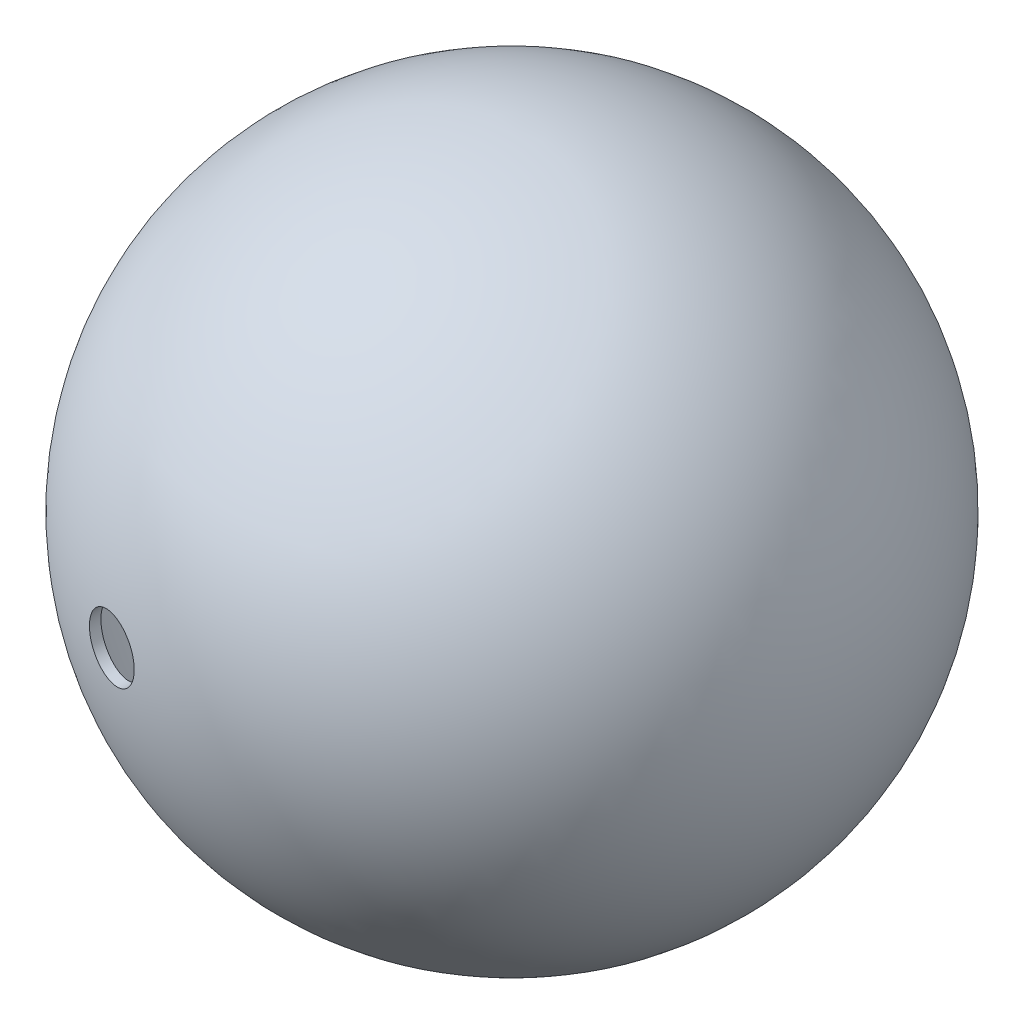
ISO-10303-21;
HEADER;
FILE_DESCRIPTION(('STEP AP214'),'2;1');
FILE_NAME('part.step','',(''),(''),'','','');
FILE_SCHEMA(('AUTOMOTIVE_DESIGN { 1 0 10303 214 1 1 1 1 }'));
ENDSEC;
DATA;
#1=APPLICATION_CONTEXT('core data for automotive mechanical design processes');
#2=APPLICATION_PROTOCOL_DEFINITION('international standard','automotive_design',2000,#1);
#3=PRODUCT_CONTEXT('',#1,'mechanical');
#4=PRODUCT('Part','Part','',(#3));
#5=PRODUCT_RELATED_PRODUCT_CATEGORY('part','',(#4));
#6=PRODUCT_DEFINITION_FORMATION('','',#4);
#7=PRODUCT_DEFINITION_CONTEXT('part definition',#1,'design');
#8=PRODUCT_DEFINITION('design','',#6,#7);
#9=PRODUCT_DEFINITION_SHAPE('','',#8);
#10=(LENGTH_UNIT() NAMED_UNIT(*) SI_UNIT(.MILLI.,.METRE.));
#11=(NAMED_UNIT(*) PLANE_ANGLE_UNIT() SI_UNIT($,.RADIAN.));
#12=(NAMED_UNIT(*) SI_UNIT($,.STERADIAN.) SOLID_ANGLE_UNIT());
#13=UNCERTAINTY_MEASURE_WITH_UNIT(LENGTH_MEASURE(1.E-05),#10,'distance_accuracy_value','');
#14=(GEOMETRIC_REPRESENTATION_CONTEXT(3) GLOBAL_UNCERTAINTY_ASSIGNED_CONTEXT((#13)) GLOBAL_UNIT_ASSIGNED_CONTEXT((#10,
#11,#12)) REPRESENTATION_CONTEXT('',''));
#15=CARTESIAN_POINT('',(0.,0.,0.));
#16=DIRECTION('',(0.,0.,1.));
#17=DIRECTION('',(1.,0.,0.));
#18=AXIS2_PLACEMENT_3D('',#15,#16,#17);
#19=CARTESIAN_POINT('',(0.,0.,0.));
#20=DIRECTION('',(0.,1.,0.));
#21=DIRECTION('',(1.,0.,0.));
#22=AXIS2_PLACEMENT_3D('',#19,#20,#21);
#23=SPHERICAL_SURFACE('',#22,11.99);
#24=CARTESIAN_POINT('',(-3.95136058227673,-0.552189317616778,11.3067208555947));
#25=CARTESIAN_POINT('',(-3.92007006963208,-0.606093087319684,11.3150231329755));
#26=CARTESIAN_POINT('',(-3.88423802164864,-0.657240591148591,11.3245213102823));
#27=CARTESIAN_POINT('',(-3.8046783739078,-0.75256841648249,11.3455780125305));
#28=CARTESIAN_POINT('',(-3.76093829258161,-0.796737514159434,11.3571397941678));
#29=CARTESIAN_POINT('',(-3.66703639502787,-0.876847951739898,11.3819169969643));
#30=CARTESIAN_POINT('',(-3.61688677865954,-0.912804569935177,11.3951292755283));
#31=CARTESIAN_POINT('',(-3.51158198788507,-0.975728787554527,11.4228192475459));
#32=CARTESIAN_POINT('',(-3.45642809601233,-1.00269868193103,11.4372966167374));
#33=CARTESIAN_POINT('',(-3.34124062454943,-1.04760050331811,11.4674709103668));
#34=CARTESIAN_POINT('',(-3.28112143498747,-1.06529874869775,11.4831888276857));
#35=CARTESIAN_POINT('',(-3.15886602784906,-1.09025478415775,11.5150839433738));
#36=CARTESIAN_POINT('',(-3.09672944398037,-1.09751066728654,11.5312612250808));
#37=CARTESIAN_POINT('',(-2.97081068101053,-1.10145273022891,11.5639746172238));
#38=CARTESIAN_POINT('',(-2.90702140670561,-1.09791307165853,11.5805111089258));
#39=CARTESIAN_POINT('',(-2.78089818541203,-1.07983939798418,11.6131381273939));
#40=CARTESIAN_POINT('',(-2.71856429950102,-1.06530492231744,11.6292286354489));
#41=CARTESIAN_POINT('',(-2.59707860147303,-1.02554547056807,11.6605263050606));
#42=CARTESIAN_POINT('',(-2.537930516673,-1.00030826611846,11.6757324335034));
#43=CARTESIAN_POINT('',(-2.42467599062205,-0.939747078835163,11.7047962585116));
#44=CARTESIAN_POINT('',(-2.37056912714535,-0.90442394175439,11.7186540680094));
#45=CARTESIAN_POINT('',(-2.27007810948992,-0.825362623719269,11.7443515623027));
#46=CARTESIAN_POINT('',(-2.22356668947404,-0.781797195528925,11.7562246064173));
#47=CARTESIAN_POINT('',(-2.13855862553192,-0.687000447767174,11.7778973493299));
#48=CARTESIAN_POINT('',(-2.10006059764951,-0.635770454538776,11.7876974061487));
#49=CARTESIAN_POINT('',(-2.03343087931812,-0.528767938142816,11.8046425016905));
#50=CARTESIAN_POINT('',(-2.00501965541982,-0.473180828867069,11.8118591897618));
#51=CARTESIAN_POINT('',(-1.95794447148124,-0.357773353017351,11.8238094169681));
#52=CARTESIAN_POINT('',(-1.93927876715179,-0.297953746169371,11.8285434004675));
#53=CARTESIAN_POINT('',(-1.91273011621139,-0.177585073089124,11.8352748333832));
#54=CARTESIAN_POINT('',(-1.9045598962234,-0.117103326132756,11.8373451917913));
#55=CARTESIAN_POINT('',(-1.89832834082966,0.0044094872714547,11.8389243869402));
#56=CARTESIAN_POINT('',(-1.9002659825601,0.0654404975127244,11.8384334828677));
#57=CARTESIAN_POINT('',(-1.91408630331005,0.185447383369671,11.8349307177107));
#58=CARTESIAN_POINT('',(-1.92583385585512,0.244439901233852,11.8319531096446));
#59=CARTESIAN_POINT('',(-1.95870618739566,0.359571002139498,11.8236153571741));
#60=CARTESIAN_POINT('',(-1.97983100938861,0.41570957209347,11.8182552018449));
#61=CARTESIAN_POINT('',(-2.03093056585431,0.523934308119346,11.8052767334101));
#62=CARTESIAN_POINT('',(-2.06095792140453,0.57599398361792,11.7976449923314));
#63=CARTESIAN_POINT('',(-2.12887448215882,0.674323285325342,11.7803619455448));
#64=CARTESIAN_POINT('',(-2.16676443604278,0.720592359477629,11.7707104475141));
#65=CARTESIAN_POINT('',(-2.25022077455481,0.807172670156223,11.7494208768963));
#66=CARTESIAN_POINT('',(-2.29594193906558,0.847324755179683,11.7377426695921));
#67=CARTESIAN_POINT('',(-2.39309229671554,0.919414831035465,11.7128860890259));
#68=CARTESIAN_POINT('',(-2.44452232746755,0.951351614220797,11.6997074956179));
#69=CARTESIAN_POINT('',(-2.55329451164522,1.00712539890945,11.6717836439493));
#70=CARTESIAN_POINT('',(-2.61076871691144,1.03068718213538,11.6570029786318));
#71=CARTESIAN_POINT('',(-2.72865827630604,1.06779877282052,11.6266238025337));
#72=CARTESIAN_POINT('',(-2.78907406686747,1.08134708976136,11.6110251703676));
#73=CARTESIAN_POINT('',(-2.9128066837522,1.09836101784881,11.5790121549413));
#74=CARTESIAN_POINT('',(-2.97615810616852,1.10155578399867,11.5625871070558));
#75=CARTESIAN_POINT('',(-3.10248180661712,1.09703825862355,11.5297648963618));
#76=CARTESIAN_POINT('',(-3.16545405006725,1.0893249869455,11.5133677361918));
#77=CARTESIAN_POINT('',(-3.2899102647017,1.06303273478237,11.4808930314656));
#78=CARTESIAN_POINT('',(-3.35137193433293,1.04434153758964,11.4648205873668));
#79=CARTESIAN_POINT('',(-3.47032479225684,0.996446175410824,11.4336518351617));
#80=CARTESIAN_POINT('',(-3.52781606301422,0.967242228851597,11.418555506782));
#81=CARTESIAN_POINT('',(-3.63648499832363,0.89941347787477,11.3899689365462));
#82=CARTESIAN_POINT('',(-3.68772434043957,0.860894214522903,11.3764630602257));
#83=CARTESIAN_POINT('',(-3.78298167180451,0.775267093569931,11.351315710672));
#84=CARTESIAN_POINT('',(-3.82700074243292,0.728160524324276,11.3396739582553));
#85=CARTESIAN_POINT('',(-3.9052076033121,0.628105506150249,11.3189645691928));
#86=CARTESIAN_POINT('',(-3.93963869343792,0.575360491248587,11.309833322968));
#87=CARTESIAN_POINT('',(-3.99910594065723,0.46448047975156,11.2940482995499));
#88=CARTESIAN_POINT('',(-4.02414443339751,0.406346827632753,11.2873939064433));
#89=CARTESIAN_POINT('',(-4.06327547004254,0.288406657523373,11.276988672681));
#90=CARTESIAN_POINT('',(-4.07770189306788,0.22871860999623,11.2731492800628));
#91=CARTESIAN_POINT('',(-4.09643164587365,0.107649275597538,11.2681638479551));
#92=CARTESIAN_POINT('',(-4.10073377461714,0.0462677887083777,11.2670181280139));
#93=CARTESIAN_POINT('',(-4.09907831624573,-0.0750479152176993,11.2674588997241));
#94=CARTESIAN_POINT('',(-4.09333375846744,-0.134985514691149,11.268988660659));
#95=CARTESIAN_POINT('',(-4.07219264708447,-0.252951857043323,11.2746153807927));
#96=CARTESIAN_POINT('',(-4.05680873775026,-0.310982995907006,11.278708976917));
#97=CARTESIAN_POINT('',(-4.02550436768047,-0.399383702321013,11.2870316129476));
#98=CARTESIAN_POINT('',(-4.01263994872038,-0.430948683819797,11.290450594328));
#99=CARTESIAN_POINT('',(-3.98408587743288,-0.492677850648538,11.2980351913969));
#100=CARTESIAN_POINT('',(-3.96839631327502,-0.522842079657431,11.3022007837845));
#101=CARTESIAN_POINT('',(-3.95136058227673,-0.552189317616778,11.3067208555947));
#102=B_SPLINE_CURVE_WITH_KNOTS('',3,(#24,#25,#26,#27,#28,#29,#30,#31,#32,#33,#34,#35,#36,#37,
#38,#39,#40,#41,#42,#43,#44,#45,#46,#47,#48,#49,#50,#51,#52,#53,#54,#55,#56,#57,#58,#59,#60,#61,
#62,#63,#64,#65,#66,#67,#68,#69,#70,#71,#72,#73,#74,#75,#76,#77,#78,#79,#80,#81,#82,#83,#84,#85,
#86,#87,#88,#89,#90,#91,#92,#93,#94,#95,#96,#97,#98,#99,#100,#101),.UNSPECIFIED.,.T.,.F.,(4,2,2,
2,2,2,2,2,2,2,2,2,2,2,2,2,2,2,2,2,2,2,2,2,2,2,2,2,2,2,2,2,2,2,2,2,2,2,4),(0.,0.188503977465546,
0.377308117832125,0.565758097559766,0.75415991559979,0.947105902832931,1.14008712079054,
1.33713291849562,1.53418697072495,1.73146677556009,1.9287300424109,2.12224297672385,
2.31572246252578,2.50332077153593,2.69088549198584,2.87319859147564,3.05549324217181,
3.23531751839425,3.41514261917158,3.59605257209164,3.77697975924403,3.96201548871129,
4.14707840285348,4.33775746417944,4.52846490263534,4.72412253069713,4.91979774089524,
5.11750884339824,5.31521583822966,5.51077993820477,5.70631472176504,5.89630710195313,
6.08625220557836,6.26993055703049,6.45363069700076,6.63348274724932,6.81309937181975,
6.91573122370195,7.01835987311655),.UNSPECIFIED.);
#103=CARTESIAN_POINT('',(-3.95136058227673,-0.552189317616778,11.3067208555947));
#104=VERTEX_POINT('',#103);
#105=EDGE_CURVE('E10',#104,#104,#102,.T.);
#106=ORIENTED_EDGE('',*,*,#105,.F.);
#107=EDGE_LOOP('',(#106));
#108=FACE_BOUND('',#107,.T.);
#109=CARTESIAN_POINT('',(0.,0.,-11.608625));
#110=DIRECTION('',(0.,0.,-1.));
#111=DIRECTION('',(-1.,0.,0.));
#112=AXIS2_PLACEMENT_3D('',#109,#110,#111);
#113=CIRCLE('',#112,2.99998760153688);
#114=CARTESIAN_POINT('',(2.99998760153688,0.,-11.608625));
#115=VERTEX_POINT('',#114);
#116=EDGE_CURVE('E46',#115,#115,#113,.T.);
#117=ORIENTED_EDGE('',*,*,#116,.F.);
#118=EDGE_LOOP('',(#117));
#119=FACE_BOUND('',#118,.T.);
#120=ADVANCED_FACE('F33',(#108,#119),#23,.T.);
#121=CARTESIAN_POINT('',(0.,0.,0.));
#122=DIRECTION('',(0.,1.,0.));
#123=DIRECTION('',(1.,0.,0.));
#124=AXIS2_PLACEMENT_3D('',#121,#122,#123);
#125=SPHERICAL_SURFACE('',#124,11.6);
#126=CARTESIAN_POINT('',(-3.94750064705811,-0.558786653226896,10.893346415021));
#127=CARTESIAN_POINT('',(-3.91579921975448,-0.612534579250892,10.9020769062187));
#128=CARTESIAN_POINT('',(-3.87957116553582,-0.663477403184826,10.9120435658877));
#129=CARTESIAN_POINT('',(-3.79927398504121,-0.758309849159791,10.9340970142459));
#130=CARTESIAN_POINT('',(-3.75519220579061,-0.802187868780123,10.9461872236909));
#131=CARTESIAN_POINT('',(-3.66068432151484,-0.8816451637554,10.9720581822312));
#132=CARTESIAN_POINT('',(-3.61027092671872,-0.917240668248733,10.9858355431542));
#133=CARTESIAN_POINT('',(-3.50451958860304,-0.979399019813475,11.0146761285415));
#134=CARTESIAN_POINT('',(-3.44918292329045,-1.00596420243884,11.0297390192606));
#135=CARTESIAN_POINT('',(-3.33360698301853,-1.05006167741685,11.0611306166593));
#136=CARTESIAN_POINT('',(-3.27327792725348,-1.06734258782366,11.0774819854143));
#137=CARTESIAN_POINT('',(-3.15067674642512,-1.09142151118508,11.1106351929725));
#138=CARTESIAN_POINT('',(-3.08840425126167,-1.09821751485778,11.1274371174909));
#139=CARTESIAN_POINT('',(-2.96222054914891,-1.10120036205318,11.1614054394383));
#140=CARTESIAN_POINT('',(-2.89830353942117,-1.0971494411157,11.1785716860875));
#141=CARTESIAN_POINT('',(-2.77200655347582,-1.07800677515282,11.2124148685054));
#142=CARTESIAN_POINT('',(-2.7096266415614,-1.06291456903241,11.2290917838089));
#143=CARTESIAN_POINT('',(-2.58817258270224,-1.02201086643739,11.2614931198596));
#144=CARTESIAN_POINT('',(-2.52910039282389,-0.996193098496265,11.2772169771592));
#145=CARTESIAN_POINT('',(-2.41609313257974,-0.934450136642098,11.3072395737712));
#146=CARTESIAN_POINT('',(-2.36215758166076,-0.898525889476521,11.3215384464026));
#147=CARTESIAN_POINT('',(-2.26220748567293,-0.81834054334261,11.3479921895439));
#148=CARTESIAN_POINT('',(-2.21605108015498,-0.774269152763383,11.3601855886095));
#149=CARTESIAN_POINT('',(-2.13183754994337,-0.678496493260177,11.3824030161895));
#150=CARTESIAN_POINT('',(-2.09377890357566,-0.626796660917066,11.3924274522861));
#151=CARTESIAN_POINT('',(-2.02817778983461,-0.519046988934957,11.4096891104602));
#152=CARTESIAN_POINT('',(-2.00033232720215,-0.463194495566803,11.4170067054663));
#153=CARTESIAN_POINT('',(-1.95442294632343,-0.347344836980255,11.4290637822135));
#154=CARTESIAN_POINT('',(-1.9363571613717,-0.287348465195671,11.4338037559613));
#155=CARTESIAN_POINT('',(-1.91103420147838,-0.166831479453876,11.4404460383348));
#156=CARTESIAN_POINT('',(-1.90347252654432,-0.106379114349185,11.4424282922287));
#157=CARTESIAN_POINT('',(-1.89842726540228,0.0149708238779417,11.4437509980386));
#158=CARTESIAN_POINT('',(-1.90094262258378,0.0758683496554567,11.4430917269272));
#159=CARTESIAN_POINT('',(-1.91585657770953,0.195489269868782,11.4391810972663));
#160=CARTESIAN_POINT('',(-1.92811736862142,0.254231116009758,11.4359658814213));
#161=CARTESIAN_POINT('',(-1.96193873403137,0.368775103905187,11.4270900555164));
#162=CARTESIAN_POINT('',(-1.98349938433741,0.424577221692228,11.4214294255227));
#163=CARTESIAN_POINT('',(-2.03540341871431,0.532111899087534,11.4077879584004));
#164=CARTESIAN_POINT('',(-2.06580741920898,0.583813126625235,11.3997911059944));
#165=CARTESIAN_POINT('',(-2.13438241155406,0.681368028368884,11.38173039798));
#166=CARTESIAN_POINT('',(-2.17255420441354,0.72722109872324,11.3716663292007));
#167=CARTESIAN_POINT('',(-2.25655391424891,0.813006419629246,11.3494846679263));
#168=CARTESIAN_POINT('',(-2.3025470349824,0.852765321718532,11.3373226590591));
#169=CARTESIAN_POINT('',(-2.40014946809869,0.924030569034005,11.3114663144553));
#170=CARTESIAN_POINT('',(-2.45175965853658,0.955535621395972,11.2977717391399));
#171=CARTESIAN_POINT('',(-2.56091686965299,1.01047458350766,11.2687495225816));
#172=CARTESIAN_POINT('',(-2.61860221431262,1.03361333352975,11.2533833031621));
#173=CARTESIAN_POINT('',(-2.73683038033006,1.06984402530607,11.2218210088649));
#174=CARTESIAN_POINT('',(-2.79737365112182,1.08293438123745,11.2056248034301));
#175=CARTESIAN_POINT('',(-2.92137870360376,1.0990148852532,11.1723771613039));
#176=CARTESIAN_POINT('',(-2.98487494409137,1.10171700109753,11.1553144553916));
#177=CARTESIAN_POINT('',(-3.1114043869395,1.0961752370632,11.1212348292407));
#178=CARTESIAN_POINT('',(-3.17443754480302,1.08793031878092,11.104217913499));
#179=CARTESIAN_POINT('',(-3.29895197502935,1.06053490425555,11.0705273115183));
#180=CARTESIAN_POINT('',(-3.36040926613918,1.04126807340143,11.053859284981));
#181=CARTESIAN_POINT('',(-3.47925857229266,0.992191520771177,11.0215565875019));
#182=CARTESIAN_POINT('',(-3.53665068763212,0.962382059211124,11.0059218910666));
#183=CARTESIAN_POINT('',(-3.64495220273247,0.893369868533277,10.9763610963771));
#184=CARTESIAN_POINT('',(-3.69593139873714,0.854284682475225,10.9624166763168));
#185=CARTESIAN_POINT('',(-3.79057221663591,0.767537441602637,10.9364864154228));
#186=CARTESIAN_POINT('',(-3.83423504349491,0.719876801803759,10.9245002520831));
#187=CARTESIAN_POINT('',(-3.91154170008896,0.618879134849739,10.9032499563278));
#188=CARTESIAN_POINT('',(-3.94545214136898,0.565761503673728,10.8939135056544));
#189=CARTESIAN_POINT('',(-4.00381986137927,0.45420842759505,10.8778281789588));
#190=CARTESIAN_POINT('',(-4.02827965714226,0.395774403760463,10.8710786139637));
#191=CARTESIAN_POINT('',(-4.06617491692198,0.277475132929482,10.8606158697491));
#192=CARTESIAN_POINT('',(-4.07996967277621,0.21773358826422,10.8568037481663));
#193=CARTESIAN_POINT('',(-4.09744956945863,0.0966633633104391,10.8519725668646));
#194=CARTESIAN_POINT('',(-4.10113358213362,0.0353345066808022,10.8509538188293));
#195=CARTESIAN_POINT('',(-4.09829015091979,-0.0857024829913383,10.851739912789));
#196=CARTESIAN_POINT('',(-4.09198587916278,-0.145416556218633,10.8534830450529));
#197=CARTESIAN_POINT('',(-4.06980182839987,-0.262840623633015,10.8596131771284));
#198=CARTESIAN_POINT('',(-4.05393461950268,-0.320553143649803,10.8639967062369));
#199=CARTESIAN_POINT('',(-4.02203032253996,-0.408162536546849,10.8728022096993));
#200=CARTESIAN_POINT('',(-4.00903751695097,-0.439289814340409,10.876386832159));
#201=CARTESIAN_POINT('',(-3.98029999434148,-0.50014419939676,10.884310534198));
#202=CARTESIAN_POINT('',(-3.96455537396002,-0.529871355782903,10.8886495872829));
#203=CARTESIAN_POINT('',(-3.94750064705811,-0.558786653226896,10.893346415021));
#204=B_SPLINE_CURVE_WITH_KNOTS('',3,(#126,#127,#128,#129,#130,#131,#132,#133,#134,#135,#136,
#137,#138,#139,#140,#141,#142,#143,#144,#145,#146,#147,#148,#149,#150,#151,#152,#153,#154,#155,
#156,#157,#158,#159,#160,#161,#162,#163,#164,#165,#166,#167,#168,#169,#170,#171,#172,#173,#174,
#175,#176,#177,#178,#179,#180,#181,#182,#183,#184,#185,#186,#187,#188,#189,#190,#191,#192,#193,
#194,#195,#196,#197,#198,#199,#200,#201,#202,#203),.UNSPECIFIED.,.T.,.F.,(4,2,2,2,2,2,2,2,2,2,2,
2,2,2,2,2,2,2,2,2,2,2,2,2,2,2,2,2,2,2,2,2,2,2,2,2,2,2,4),(0.,0.188895774027499,
0.378098672380356,0.566927655863585,0.75570776440838,0.949370202075009,1.14306974776062,
1.34104974774712,1.53903801604651,1.73714221564905,1.93522786356523,2.12917802943952,
2.32309171730959,2.51066897019065,2.69821040644554,2.88019303520823,3.0621565829831,
3.24159186135281,3.42102860242019,3.60172550043131,3.78244104122535,3.96760103173844,
4.15279000797351,4.34398976237079,4.53521968543304,4.7317150929766,4.92822914083117,
5.12685667547232,5.32547930787687,5.52170803122327,5.71790440496972,5.90807273377145,
6.09819037922089,6.28158435455584,6.46499879209475,6.64437257905674,6.82351109883276,
6.92513677408256,7.02675888112869),.UNSPECIFIED.);
#205=CARTESIAN_POINT('',(-3.94750064705811,-0.558786653226896,10.893346415021));
#206=VERTEX_POINT('',#205);
#207=EDGE_CURVE('E41',#206,#206,#204,.T.);
#208=ORIENTED_EDGE('',*,*,#207,.T.);
#209=EDGE_LOOP('',(#208));
#210=FACE_BOUND('',#209,.T.);
#211=CARTESIAN_POINT('',(0.,0.,-11.2120689655172));
#212=DIRECTION('',(0.,0.,-1.));
#213=DIRECTION('',(-1.,0.,0.));
#214=AXIS2_PLACEMENT_3D('',#211,#212,#213);
#215=CIRCLE('',#214,2.97481251719922);
#216=CARTESIAN_POINT('',(2.97481251719922,0.,-11.2120689655172));
#217=VERTEX_POINT('',#216);
#218=EDGE_CURVE('E37',#217,#217,#215,.T.);
#219=ORIENTED_EDGE('',*,*,#218,.T.);
#220=EDGE_LOOP('',(#219));
#221=FACE_BOUND('',#220,.T.);
#222=ADVANCED_FACE('F58',(#210,#221),#125,.F.);
#223=CARTESIAN_POINT('',(-3.,0.,100.));
#224=DIRECTION('',(0.,0.,-1.));
#225=DIRECTION('',(-1.,0.,0.));
#226=AXIS2_PLACEMENT_3D('',#223,#224,#225);
#227=CYLINDRICAL_SURFACE('',#226,1.1);
#228=ORIENTED_EDGE('',*,*,#207,.F.);
#229=EDGE_LOOP('',(#228));
#230=FACE_BOUND('',#229,.T.);
#231=ORIENTED_EDGE('',*,*,#105,.T.);
#232=EDGE_LOOP('',(#231));
#233=FACE_BOUND('',#232,.T.);
#234=ADVANCED_FACE('F53',(#230,#233),#227,.F.);
#235=CARTESIAN_POINT('',(0.,0.,-11.6));
#236=DIRECTION('',(0.,0.,-1.));
#237=DIRECTION('',(1.,0.,0.));
#238=AXIS2_PLACEMENT_3D('',#235,#236,#237);
#239=SPHERICAL_SURFACE('',#238,3.);
#240=CARTESIAN_POINT('',(2.97481251719922,0.,-11.2120689655172));
#241=CARTESIAN_POINT('',(2.97534813871303,0.,-11.2161763281245));
#242=CARTESIAN_POINT('',(2.9758752534898,0.,-11.2202848000541));
#243=CARTESIAN_POINT('',(2.97691246075572,0.,-11.2285038920388));
#244=CARTESIAN_POINT('',(2.97742255324487,0.,-11.2326145120939));
#245=CARTESIAN_POINT('',(2.97842570712202,0.,-11.2408378298102));
#246=CARTESIAN_POINT('',(2.97891876851002,0.,-11.2449505274714));
#247=CARTESIAN_POINT('',(2.97988785174182,0.,-11.2531779298352));
#248=CARTESIAN_POINT('',(2.98036387358562,0.,-11.2572926345378));
#249=CARTESIAN_POINT('',(2.98129886955733,0.,-11.2655239803875));
#250=CARTESIAN_POINT('',(2.98175784368524,0.,-11.2696406215347));
#251=CARTESIAN_POINT('',(2.98265873635162,0.,-11.2778757696432));
#252=CARTESIAN_POINT('',(2.98310065489008,0.,-11.2819942766046));
#253=CARTESIAN_POINT('',(2.98396742879511,0.,-11.2902330856789));
#254=CARTESIAN_POINT('',(2.98439228416167,0.,-11.2943533877919));
#255=CARTESIAN_POINT('',(2.98522492443363,0.,-11.3025957164764));
#256=CARTESIAN_POINT('',(2.98563270933901,0.,-11.3067177430478));
#257=CARTESIAN_POINT('',(2.9864312016921,0.,-11.3149634499264));
#258=CARTESIAN_POINT('',(2.98682190913981,0.,-11.3190871302335));
#259=CARTESIAN_POINT('',(2.98758623987405,0.,-11.3273360738322));
#260=CARTESIAN_POINT('',(2.98795986316059,0.,-11.3314613371238));
#261=CARTESIAN_POINT('',(2.98869001916214,0.,-11.339713375913));
#262=CARTESIAN_POINT('',(2.98904655187715,0.,-11.3438401514107));
#263=CARTESIAN_POINT('',(2.98974252061851,0.,-11.3520951438078));
#264=CARTESIAN_POINT('',(2.99008195664485,0.,-11.3562233607073));
#265=CARTESIAN_POINT('',(2.99074372618508,0.,-11.3644811650789));
#266=CARTESIAN_POINT('',(2.99106605969896,0.,-11.3686107525512));
#267=CARTESIAN_POINT('',(2.99169361868388,0.,-11.3768712272159));
#268=CARTESIAN_POINT('',(2.99199884415492,0.,-11.3810021144083));
#269=CARTESIAN_POINT('',(2.99259218181732,0.,-11.3892651176386));
#270=CARTESIAN_POINT('',(2.99288029400867,0.,-11.3933972336765));
#271=CARTESIAN_POINT('',(2.99343940016848,0.,-11.4016626237016));
#272=CARTESIAN_POINT('',(2.99371039413693,0.,-11.4057958976889));
#273=CARTESIAN_POINT('',(2.99423525920141,0.,-11.4140635326971));
#274=CARTESIAN_POINT('',(2.99448913029743,0.,-11.4181978937181));
#275=CARTESIAN_POINT('',(2.9949797452613,0.,-11.4264676318592));
#276=CARTESIAN_POINT('',(2.99521648912915,0.,-11.4306030089794));
#277=CARTESIAN_POINT('',(2.99567284557479,0.,-11.438874708367));
#278=CARTESIAN_POINT('',(2.99589245815259,0.,-11.4430110306346));
#279=CARTESIAN_POINT('',(2.99631454825017,0.,-11.4512845493488));
#280=CARTESIAN_POINT('',(2.99651702576995,0.,-11.4554217457955));
#281=CARTESIAN_POINT('',(2.99690484227754,0.,-11.4636969418852));
#282=CARTESIAN_POINT('',(2.99709018126534,0.,-11.4678349415281));
#283=CARTESIAN_POINT('',(2.99744371752905,0.,-11.4761116730131));
#284=CARTESIAN_POINT('',(2.99761191480496,0.,-11.4802504048553));
#285=CARTESIAN_POINT('',(2.99793116475908,0.,-11.4885285297295));
#286=CARTESIAN_POINT('',(2.99808221743728,0.,-11.4926679227615));
#287=CARTESIAN_POINT('',(2.99836717560433,0.,-11.5009472989945));
#288=CARTESIAN_POINT('',(2.99850108109318,0.,-11.5050872821956));
#289=CARTESIAN_POINT('',(2.99875174258406,0.,-11.5133677677358));
#290=CARTESIAN_POINT('',(2.99886849858608,0.,-11.5175082700751));
#291=CARTESIAN_POINT('',(2.99908485910012,0.,-11.5257897228518));
#292=CARTESIAN_POINT('',(2.99918446361214,0.,-11.5299306732893));
#293=CARTESIAN_POINT('',(2.99936651943712,0.,-11.5382129512153));
#294=CARTESIAN_POINT('',(2.99944897075009,0.,-11.5423542787036));
#295=CARTESIAN_POINT('',(2.99959671876266,0.,-11.5506372396772));
#296=CARTESIAN_POINT('',(2.99966201546227,0.,-11.5547788731625));
#297=CARTESIAN_POINT('',(2.9997754531266,0.,-11.5630623750706));
#298=CARTESIAN_POINT('',(2.99982359409133,0.,-11.5672042434935));
#299=CARTESIAN_POINT('',(2.99990271946442,0.,-11.5754881442136));
#300=CARTESIAN_POINT('',(2.99993370387277,0.,-11.5796301765109));
#301=CARTESIAN_POINT('',(2.99997851558481,0.,-11.5879143339137));
#302=CARTESIAN_POINT('',(2.99999234288851,0.,-11.5920564590193));
#303=CARTESIAN_POINT('',(3.00000284021622,0.,-11.6003407309711));
#304=CARTESIAN_POINT('',(2.99999951024023,0.,-11.6044828778174));
#305=CARTESIAN_POINT('',(2.99998760153688,0.,-11.608625));
#306=B_SPLINE_CURVE_WITH_KNOTS('',3,(#240,#241,#242,#243,#244,#245,#246,#247,#248,#249,#250,
#251,#252,#253,#254,#255,#256,#257,#258,#259,#260,#261,#262,#263,#264,#265,#266,#267,#268,#269,
#270,#271,#272,#273,#274,#275,#276,#277,#278,#279,#280,#281,#282,#283,#284,#285,#286,#287,#288,
#289,#290,#291,#292,#293,#294,#295,#296,#297,#298,#299,#300,#301,#302,#303,#304,#305),
.UNSPECIFIED.,.F.,.F.,(4,2,2,2,2,2,2,2,2,2,2,2,2,2,2,2,2,2,2,2,2,2,2,2,2,2,2,2,2,2,2,2,4),(0.,
0.0124264090204242,0.0248528180408466,0.0372792270612686,0.0497056360816925,0.0621320451021152,
0.0745584541225373,0.0869848631429614,0.0994112721633831,0.111837681183807,0.124264090204229,
0.136690499224652,0.149116908245076,0.161543317265497,0.173969726285922,0.186396135306344,
0.198822544326767,0.21124895334719,0.223675362367613,0.236101771388036,0.248528180408458,
0.260954589428881,0.273380998449304,0.285807407469726,0.29823381649015,0.310660225510573,
0.323086634530995,0.335513043551418,0.347939452571842,0.360365861592264,0.372792270612686,
0.38521867963311,0.397645088653531),.UNSPECIFIED.);
#307=EDGE_CURVE('BSEAM57',#217,#115,#306,.T.);
#308=ORIENTED_EDGE('',*,*,#218,.F.);
#309=ORIENTED_EDGE('',*,*,#116,.T.);
#310=ORIENTED_EDGE('',*,*,#307,.T.);
#311=ORIENTED_EDGE('',*,*,#307,.F.);
#312=EDGE_LOOP('',(#308,#310,#309,#311));
#313=FACE_BOUND('',#312,.T.);
#314=ADVANCED_FACE('F57',(#313),#239,.F.);
#315=CLOSED_SHELL('',(#120,#222,#234,#314));
#316=MANIFOLD_SOLID_BREP('B2',#315);
#317=ADVANCED_BREP_SHAPE_REPRESENTATION('',(#18,#316),#14);
#318=SHAPE_DEFINITION_REPRESENTATION(#9,#317);
ENDSEC;
END-ISO-10303-21;
